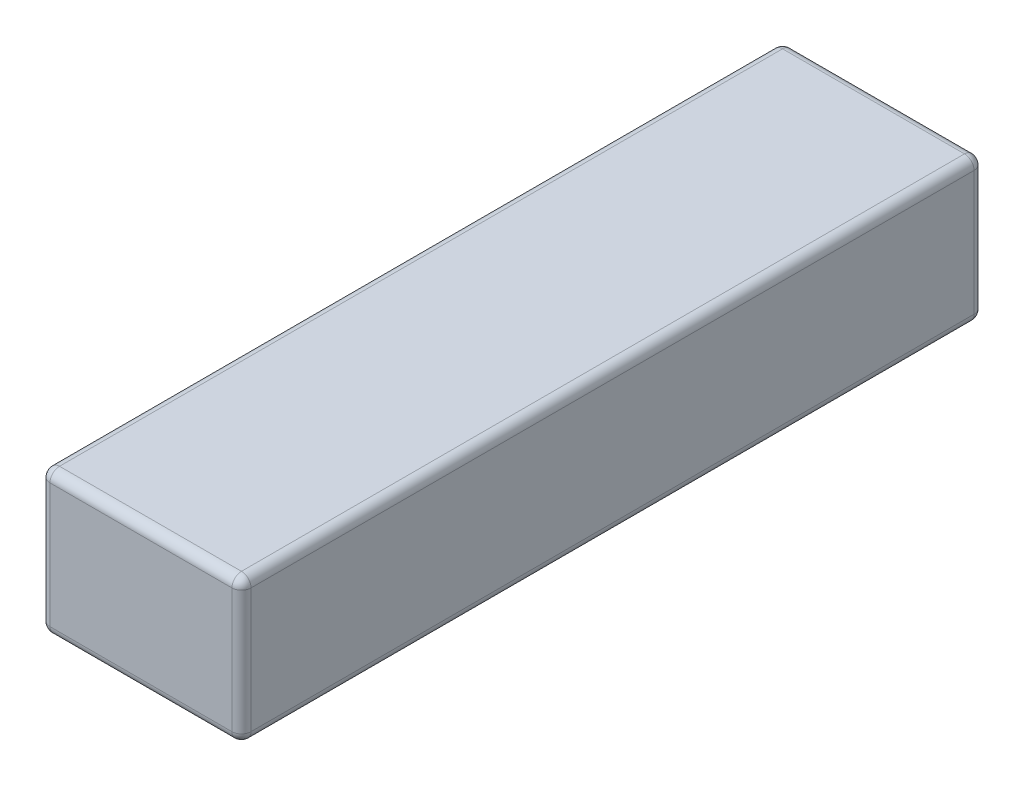
ISO-10303-21;
HEADER;
FILE_DESCRIPTION(('STEP AP214'),'2;1');
FILE_NAME('part.step','',(''),(''),'','','');
FILE_SCHEMA(('AUTOMOTIVE_DESIGN { 1 0 10303 214 1 1 1 1 }'));
ENDSEC;
DATA;
#1=APPLICATION_CONTEXT('core data for automotive mechanical design processes');
#2=APPLICATION_PROTOCOL_DEFINITION('international standard','automotive_design',2000,#1);
#3=PRODUCT_CONTEXT('',#1,'mechanical');
#4=PRODUCT('Part','Part','',(#3));
#5=PRODUCT_RELATED_PRODUCT_CATEGORY('part','',(#4));
#6=PRODUCT_DEFINITION_FORMATION('','',#4);
#7=PRODUCT_DEFINITION_CONTEXT('part definition',#1,'design');
#8=PRODUCT_DEFINITION('design','',#6,#7);
#9=PRODUCT_DEFINITION_SHAPE('','',#8);
#10=(LENGTH_UNIT() NAMED_UNIT(*) SI_UNIT(.MILLI.,.METRE.));
#11=(NAMED_UNIT(*) PLANE_ANGLE_UNIT() SI_UNIT($,.RADIAN.));
#12=(NAMED_UNIT(*) SI_UNIT($,.STERADIAN.) SOLID_ANGLE_UNIT());
#13=UNCERTAINTY_MEASURE_WITH_UNIT(LENGTH_MEASURE(1.E-05),#10,'distance_accuracy_value','');
#14=(GEOMETRIC_REPRESENTATION_CONTEXT(3) GLOBAL_UNCERTAINTY_ASSIGNED_CONTEXT((#13)) GLOBAL_UNIT_ASSIGNED_CONTEXT((#10,
#11,#12)) REPRESENTATION_CONTEXT('',''));
#15=CARTESIAN_POINT('',(0.,0.,0.));
#16=DIRECTION('',(0.,0.,1.));
#17=DIRECTION('',(1.,0.,0.));
#18=AXIS2_PLACEMENT_3D('',#15,#16,#17);
#19=CARTESIAN_POINT('',(10.1896832247371,17.1771844660194,155.));
#20=DIRECTION('',(-1.,0.,0.));
#21=DIRECTION('',(0.,-1.,0.));
#22=AXIS2_PLACEMENT_3D('',#19,#20,#21);
#23=PLANE('',#22);
#24=DIRECTION('',(0.,1.,0.));
#25=VECTOR('',#24,1.);
#26=CARTESIAN_POINT('',(10.1896832247371,-12.8228155339806,153.));
#27=LINE('',#26,#25);
#28=CARTESIAN_POINT('',(10.1896832247371,15.1771844660194,153.));
#29=VERTEX_POINT('',#28);
#30=CARTESIAN_POINT('',(10.1896832247371,-10.8228155339806,153.));
#31=VERTEX_POINT('',#30);
#32=EDGE_CURVE('E189',#29,#31,#27,.F.);
#33=ORIENTED_EDGE('',*,*,#32,.T.);
#34=DIRECTION('',(0.,0.,-1.));
#35=VECTOR('',#34,1.);
#36=CARTESIAN_POINT('',(10.1896832247371,-10.8228155339806,155.));
#37=LINE('',#36,#35);
#38=CARTESIAN_POINT('',(10.1896832247371,-10.8228155339806,2.));
#39=VERTEX_POINT('',#38);
#40=EDGE_CURVE('E192',#31,#39,#37,.T.);
#41=ORIENTED_EDGE('',*,*,#40,.T.);
#42=DIRECTION('',(0.,1.,0.));
#43=VECTOR('',#42,1.);
#44=CARTESIAN_POINT('',(10.1896832247371,17.1771844660194,2.));
#45=LINE('',#44,#43);
#46=CARTESIAN_POINT('',(10.1896832247371,15.1771844660194,2.));
#47=VERTEX_POINT('',#46);
#48=EDGE_CURVE('E187',#39,#47,#45,.T.);
#49=ORIENTED_EDGE('',*,*,#48,.T.);
#50=DIRECTION('',(0.,0.,-1.));
#51=VECTOR('',#50,1.);
#52=CARTESIAN_POINT('',(10.1896832247371,15.1771844660194,155.));
#53=LINE('',#52,#51);
#54=EDGE_CURVE('E185',#47,#29,#53,.F.);
#55=ORIENTED_EDGE('',*,*,#54,.T.);
#56=EDGE_LOOP('',(#33,#41,#49,#55));
#57=FACE_BOUND('',#56,.T.);
#58=ADVANCED_FACE('F33',(#57),#23,.F.);
#59=CARTESIAN_POINT('',(-31.810316775263,17.1771844660194,155.));
#60=DIRECTION('',(0.,-1.,0.));
#61=DIRECTION('',(0.,0.,-1.));
#62=AXIS2_PLACEMENT_3D('',#59,#60,#61);
#63=PLANE('',#62);
#64=DIRECTION('',(-1.,0.,0.));
#65=VECTOR('',#64,1.);
#66=CARTESIAN_POINT('',(-31.810316775263,17.1771844660194,2.));
#67=LINE('',#66,#65);
#68=CARTESIAN_POINT('',(8.18968322473706,17.1771844660194,2.));
#69=VERTEX_POINT('',#68);
#70=CARTESIAN_POINT('',(-29.8103167752629,17.1771844660194,2.));
#71=VERTEX_POINT('',#70);
#72=EDGE_CURVE('E178',#69,#71,#67,.T.);
#73=ORIENTED_EDGE('',*,*,#72,.T.);
#74=DIRECTION('',(0.,0.,-1.));
#75=VECTOR('',#74,1.);
#76=CARTESIAN_POINT('',(-29.8103167752629,17.1771844660194,155.));
#77=LINE('',#76,#75);
#78=CARTESIAN_POINT('',(-29.8103167752629,17.1771844660194,153.));
#79=VERTEX_POINT('',#78);
#80=EDGE_CURVE('E183',#71,#79,#77,.F.);
#81=ORIENTED_EDGE('',*,*,#80,.T.);
#82=DIRECTION('',(-1.,0.,0.));
#83=VECTOR('',#82,1.);
#84=CARTESIAN_POINT('',(10.1896832247371,17.1771844660194,153.));
#85=LINE('',#84,#83);
#86=CARTESIAN_POINT('',(8.18968322473706,17.1771844660194,153.));
#87=VERTEX_POINT('',#86);
#88=EDGE_CURVE('E180',#79,#87,#85,.F.);
#89=ORIENTED_EDGE('',*,*,#88,.T.);
#90=DIRECTION('',(0.,0.,-1.));
#91=VECTOR('',#90,1.);
#92=CARTESIAN_POINT('',(8.18968322473706,17.1771844660194,155.));
#93=LINE('',#92,#91);
#94=EDGE_CURVE('E176',#87,#69,#93,.T.);
#95=ORIENTED_EDGE('',*,*,#94,.T.);
#96=EDGE_LOOP('',(#73,#81,#89,#95));
#97=FACE_BOUND('',#96,.T.);
#98=ADVANCED_FACE('F279',(#97),#63,.F.);
#99=CARTESIAN_POINT('',(-31.810316775263,17.1771844660194,155.));
#100=DIRECTION('',(1.,0.,0.));
#101=DIRECTION('',(0.,0.,-1.));
#102=AXIS2_PLACEMENT_3D('',#99,#100,#101);
#103=PLANE('',#102);
#104=DIRECTION('',(0.,-1.,0.));
#105=VECTOR('',#104,1.);
#106=CARTESIAN_POINT('',(-31.810316775263,17.1771844660194,2.));
#107=LINE('',#106,#105);
#108=CARTESIAN_POINT('',(-31.810316775263,15.1771844660194,2.));
#109=VERTEX_POINT('',#108);
#110=CARTESIAN_POINT('',(-31.810316775263,-10.8228155339806,2.));
#111=VERTEX_POINT('',#110);
#112=EDGE_CURVE('E169',#109,#111,#107,.T.);
#113=ORIENTED_EDGE('',*,*,#112,.T.);
#114=DIRECTION('',(0.,0.,-1.));
#115=VECTOR('',#114,1.);
#116=CARTESIAN_POINT('',(-31.810316775263,-10.8228155339806,155.));
#117=LINE('',#116,#115);
#118=CARTESIAN_POINT('',(-31.810316775263,-10.8228155339806,153.));
#119=VERTEX_POINT('',#118);
#120=EDGE_CURVE('E174',#111,#119,#117,.F.);
#121=ORIENTED_EDGE('',*,*,#120,.T.);
#122=DIRECTION('',(0.,-1.,0.));
#123=VECTOR('',#122,1.);
#124=CARTESIAN_POINT('',(-31.810316775263,17.1771844660194,153.));
#125=LINE('',#124,#123);
#126=CARTESIAN_POINT('',(-31.810316775263,15.1771844660194,153.));
#127=VERTEX_POINT('',#126);
#128=EDGE_CURVE('E171',#119,#127,#125,.F.);
#129=ORIENTED_EDGE('',*,*,#128,.T.);
#130=DIRECTION('',(0.,0.,-1.));
#131=VECTOR('',#130,1.);
#132=CARTESIAN_POINT('',(-31.810316775263,15.1771844660194,155.));
#133=LINE('',#132,#131);
#134=EDGE_CURVE('E167',#127,#109,#133,.T.);
#135=ORIENTED_EDGE('',*,*,#134,.T.);
#136=EDGE_LOOP('',(#113,#121,#129,#135));
#137=FACE_BOUND('',#136,.T.);
#138=ADVANCED_FACE('F270',(#137),#103,.F.);
#139=CARTESIAN_POINT('',(-31.810316775263,-12.8228155339806,155.));
#140=DIRECTION('',(0.,1.,0.));
#141=DIRECTION('',(0.,0.,1.));
#142=AXIS2_PLACEMENT_3D('',#139,#140,#141);
#143=PLANE('',#142);
#144=DIRECTION('',(1.,0.,0.));
#145=VECTOR('',#144,1.);
#146=CARTESIAN_POINT('',(-31.810316775263,-12.8228155339806,153.));
#147=LINE('',#146,#145);
#148=CARTESIAN_POINT('',(8.18968322473706,-12.8228155339806,153.));
#149=VERTEX_POINT('',#148);
#150=CARTESIAN_POINT('',(-29.8103167752629,-12.8228155339806,153.));
#151=VERTEX_POINT('',#150);
#152=EDGE_CURVE('E128',#149,#151,#147,.F.);
#153=ORIENTED_EDGE('',*,*,#152,.T.);
#154=DIRECTION('',(0.,0.,-1.));
#155=VECTOR('',#154,1.);
#156=CARTESIAN_POINT('',(-29.8103167752629,-12.8228155339806,155.));
#157=LINE('',#156,#155);
#158=CARTESIAN_POINT('',(-29.8103167752629,-12.8228155339806,2.));
#159=VERTEX_POINT('',#158);
#160=EDGE_CURVE('E165',#151,#159,#157,.T.);
#161=ORIENTED_EDGE('',*,*,#160,.T.);
#162=DIRECTION('',(1.,0.,0.));
#163=VECTOR('',#162,1.);
#164=CARTESIAN_POINT('',(-31.810316775263,-12.8228155339806,2.));
#165=LINE('',#164,#163);
#166=CARTESIAN_POINT('',(8.18968322473706,-12.8228155339806,2.));
#167=VERTEX_POINT('',#166);
#168=EDGE_CURVE('E158',#159,#167,#165,.T.);
#169=ORIENTED_EDGE('',*,*,#168,.T.);
#170=DIRECTION('',(0.,0.,-1.));
#171=VECTOR('',#170,1.);
#172=CARTESIAN_POINT('',(8.18968322473706,-12.8228155339806,155.));
#173=LINE('',#172,#171);
#174=EDGE_CURVE('E156',#167,#149,#173,.F.);
#175=ORIENTED_EDGE('',*,*,#174,.T.);
#176=EDGE_LOOP('',(#153,#161,#169,#175));
#177=FACE_BOUND('',#176,.T.);
#178=ADVANCED_FACE('F307',(#177),#143,.F.);
#179=CARTESIAN_POINT('',(0.,0.,155.));
#180=DIRECTION('',(0.,0.,1.));
#181=DIRECTION('',(1.,0.,0.));
#182=AXIS2_PLACEMENT_3D('',#179,#180,#181);
#183=PLANE('',#182);
#184=DIRECTION('',(0.,-1.,0.));
#185=VECTOR('',#184,1.);
#186=CARTESIAN_POINT('',(-29.8103167752629,-12.8228155339806,155.));
#187=LINE('',#186,#185);
#188=CARTESIAN_POINT('',(-29.8103167752629,15.1771844660194,155.));
#189=VERTEX_POINT('',#188);
#190=CARTESIAN_POINT('',(-29.8103167752629,-10.8228155339806,155.));
#191=VERTEX_POINT('',#190);
#192=EDGE_CURVE('E154',#189,#191,#187,.T.);
#193=ORIENTED_EDGE('',*,*,#192,.T.);
#194=DIRECTION('',(1.,0.,0.));
#195=VECTOR('',#194,1.);
#196=CARTESIAN_POINT('',(10.1896832247371,-10.8228155339806,155.));
#197=LINE('',#196,#195);
#198=CARTESIAN_POINT('',(8.18968322473706,-10.8228155339806,155.));
#199=VERTEX_POINT('',#198);
#200=EDGE_CURVE('E126',#191,#199,#197,.T.);
#201=ORIENTED_EDGE('',*,*,#200,.T.);
#202=DIRECTION('',(0.,1.,0.));
#203=VECTOR('',#202,1.);
#204=CARTESIAN_POINT('',(8.18968322473706,17.1771844660194,155.));
#205=LINE('',#204,#203);
#206=CARTESIAN_POINT('',(8.18968322473706,15.1771844660194,155.));
#207=VERTEX_POINT('',#206);
#208=EDGE_CURVE('E144',#199,#207,#205,.T.);
#209=ORIENTED_EDGE('',*,*,#208,.T.);
#210=DIRECTION('',(-1.,0.,0.));
#211=VECTOR('',#210,1.);
#212=CARTESIAN_POINT('',(-31.810316775263,15.1771844660194,155.));
#213=LINE('',#212,#211);
#214=EDGE_CURVE('E150',#207,#189,#213,.T.);
#215=ORIENTED_EDGE('',*,*,#214,.T.);
#216=EDGE_LOOP('',(#193,#201,#209,#215));
#217=FACE_BOUND('',#216,.T.);
#218=ADVANCED_FACE('F152',(#217),#183,.T.);
#219=CARTESIAN_POINT('',(0.,0.,0.));
#220=DIRECTION('',(0.,0.,1.));
#221=DIRECTION('',(1.,0.,0.));
#222=AXIS2_PLACEMENT_3D('',#219,#220,#221);
#223=PLANE('',#222);
#224=DIRECTION('',(0.,-1.,0.));
#225=VECTOR('',#224,1.);
#226=CARTESIAN_POINT('',(-29.8103167752629,0.,0.));
#227=LINE('',#226,#225);
#228=CARTESIAN_POINT('',(-29.8103167752629,-10.8228155339806,0.));
#229=VERTEX_POINT('',#228);
#230=CARTESIAN_POINT('',(-29.8103167752629,15.1771844660194,0.));
#231=VERTEX_POINT('',#230);
#232=EDGE_CURVE('E42',#229,#231,#227,.F.);
#233=ORIENTED_EDGE('',*,*,#232,.T.);
#234=DIRECTION('',(-1.,0.,0.));
#235=VECTOR('',#234,1.);
#236=CARTESIAN_POINT('',(0.,15.1771844660194,0.));
#237=LINE('',#236,#235);
#238=CARTESIAN_POINT('',(8.18968322473706,15.1771844660194,0.));
#239=VERTEX_POINT('',#238);
#240=EDGE_CURVE('E11',#231,#239,#237,.F.);
#241=ORIENTED_EDGE('',*,*,#240,.T.);
#242=DIRECTION('',(0.,1.,0.));
#243=VECTOR('',#242,1.);
#244=CARTESIAN_POINT('',(8.18968322473706,0.,0.));
#245=LINE('',#244,#243);
#246=CARTESIAN_POINT('',(8.18968322473706,-10.8228155339806,0.));
#247=VERTEX_POINT('',#246);
#248=EDGE_CURVE('E194',#239,#247,#245,.F.);
#249=ORIENTED_EDGE('',*,*,#248,.T.);
#250=DIRECTION('',(1.,0.,0.));
#251=VECTOR('',#250,1.);
#252=CARTESIAN_POINT('',(0.,-10.8228155339806,0.));
#253=LINE('',#252,#251);
#254=EDGE_CURVE('E53',#247,#229,#253,.F.);
#255=ORIENTED_EDGE('',*,*,#254,.T.);
#256=EDGE_LOOP('',(#233,#241,#249,#255));
#257=FACE_BOUND('',#256,.T.);
#258=ADVANCED_FACE('F291',(#257),#223,.F.);
#259=CARTESIAN_POINT('',(-31.810316775263,15.1771844660194,2.));
#260=DIRECTION('',(-1.,0.,0.));
#261=DIRECTION('',(0.,0.,1.));
#262=AXIS2_PLACEMENT_3D('',#259,#260,#261);
#263=CYLINDRICAL_SURFACE('',#262,2.);
#264=CARTESIAN_POINT('',(-29.8103167752629,15.1771844660194,2.));
#265=DIRECTION('',(-1.,0.,0.));
#266=DIRECTION('',(0.,0.,1.));
#267=AXIS2_PLACEMENT_3D('',#264,#265,#266);
#268=CIRCLE('',#267,2.);
#269=EDGE_CURVE('E37',#71,#231,#268,.T.);
#270=ORIENTED_EDGE('',*,*,#269,.F.);
#271=ORIENTED_EDGE('',*,*,#72,.F.);
#272=CARTESIAN_POINT('',(8.18968322473706,15.1771844660194,2.));
#273=DIRECTION('',(1.,0.,0.));
#274=DIRECTION('',(0.,1.,0.));
#275=AXIS2_PLACEMENT_3D('',#272,#273,#274);
#276=CIRCLE('',#275,2.);
#277=EDGE_CURVE('E248',#239,#69,#276,.T.);
#278=ORIENTED_EDGE('',*,*,#277,.F.);
#279=ORIENTED_EDGE('',*,*,#240,.F.);
#280=EDGE_LOOP('',(#270,#271,#278,#279));
#281=FACE_BOUND('',#280,.T.);
#282=ADVANCED_FACE('F35',(#281),#263,.T.);
#283=CARTESIAN_POINT('',(-29.8103167752629,15.1771844660194,2.));
#284=DIRECTION('',(0.,0.,1.));
#285=DIRECTION('',(1.,0.,0.));
#286=AXIS2_PLACEMENT_3D('',#283,#284,#285);
#287=SPHERICAL_SURFACE('',#286,2.);
#288=CARTESIAN_POINT('',(-29.8103167752629,15.1771844660194,2.));
#289=DIRECTION('',(0.,0.,-1.));
#290=DIRECTION('',(-1.,0.,0.));
#291=AXIS2_PLACEMENT_3D('',#288,#289,#290);
#292=CIRCLE('',#291,2.);
#293=EDGE_CURVE('E243',#71,#109,#292,.F.);
#294=ORIENTED_EDGE('',*,*,#293,.F.);
#295=ORIENTED_EDGE('',*,*,#269,.T.);
#296=CARTESIAN_POINT('',(-29.8103167752629,15.1771844660194,2.));
#297=DIRECTION('',(0.,1.,0.));
#298=DIRECTION('',(0.,0.,1.));
#299=AXIS2_PLACEMENT_3D('',#296,#297,#298);
#300=CIRCLE('',#299,2.);
#301=EDGE_CURVE('E246',#109,#231,#300,.F.);
#302=ORIENTED_EDGE('',*,*,#301,.F.);
#303=EDGE_LOOP('',(#294,#295,#302));
#304=FACE_BOUND('',#303,.T.);
#305=ADVANCED_FACE('F259',(#304),#287,.T.);
#306=CARTESIAN_POINT('',(8.18968322473706,15.1771844660194,2.));
#307=DIRECTION('',(0.,0.,1.));
#308=DIRECTION('',(1.,0.,0.));
#309=AXIS2_PLACEMENT_3D('',#306,#307,#308);
#310=SPHERICAL_SURFACE('',#309,2.);
#311=CARTESIAN_POINT('',(8.18968322473706,15.1771844660194,2.));
#312=DIRECTION('',(0.,1.,0.));
#313=DIRECTION('',(0.,0.,1.));
#314=AXIS2_PLACEMENT_3D('',#311,#312,#313);
#315=CIRCLE('',#314,2.);
#316=EDGE_CURVE('E237',#239,#47,#315,.F.);
#317=ORIENTED_EDGE('',*,*,#316,.F.);
#318=ORIENTED_EDGE('',*,*,#277,.T.);
#319=CARTESIAN_POINT('',(8.18968322473706,15.1771844660194,2.));
#320=DIRECTION('',(0.,0.,-1.));
#321=DIRECTION('',(-1.,0.,0.));
#322=AXIS2_PLACEMENT_3D('',#319,#320,#321);
#323=CIRCLE('',#322,2.);
#324=EDGE_CURVE('E240',#47,#69,#323,.F.);
#325=ORIENTED_EDGE('',*,*,#324,.F.);
#326=EDGE_LOOP('',(#317,#318,#325));
#327=FACE_BOUND('',#326,.T.);
#328=ADVANCED_FACE('F458',(#327),#310,.T.);
#329=CARTESIAN_POINT('',(-29.8103167752629,17.1771844660194,2.));
#330=DIRECTION('',(0.,-1.,0.));
#331=DIRECTION('',(0.,0.,-1.));
#332=AXIS2_PLACEMENT_3D('',#329,#330,#331);
#333=CYLINDRICAL_SURFACE('',#332,2.);
#334=ORIENTED_EDGE('',*,*,#301,.T.);
#335=ORIENTED_EDGE('',*,*,#232,.F.);
#336=CARTESIAN_POINT('',(-29.8103167752629,-10.8228155339806,2.));
#337=DIRECTION('',(0.,-1.,0.));
#338=DIRECTION('',(0.,0.,-1.));
#339=AXIS2_PLACEMENT_3D('',#336,#337,#338);
#340=CIRCLE('',#339,2.);
#341=EDGE_CURVE('E231',#111,#229,#340,.T.);
#342=ORIENTED_EDGE('',*,*,#341,.F.);
#343=ORIENTED_EDGE('',*,*,#112,.F.);
#344=EDGE_LOOP('',(#334,#335,#342,#343));
#345=FACE_BOUND('',#344,.T.);
#346=ADVANCED_FACE('F265',(#345),#333,.T.);
#347=CARTESIAN_POINT('',(-29.8103167752629,15.1771844660194,155.));
#348=DIRECTION('',(0.,0.,-1.));
#349=DIRECTION('',(-1.,0.,0.));
#350=AXIS2_PLACEMENT_3D('',#347,#348,#349);
#351=CYLINDRICAL_SURFACE('',#350,2.);
#352=ORIENTED_EDGE('',*,*,#293,.T.);
#353=ORIENTED_EDGE('',*,*,#134,.F.);
#354=CARTESIAN_POINT('',(-29.8103167752629,15.1771844660194,153.));
#355=DIRECTION('',(0.,0.,1.));
#356=DIRECTION('',(1.,0.,0.));
#357=AXIS2_PLACEMENT_3D('',#354,#355,#356);
#358=CIRCLE('',#357,2.);
#359=EDGE_CURVE('E228',#79,#127,#358,.T.);
#360=ORIENTED_EDGE('',*,*,#359,.F.);
#361=ORIENTED_EDGE('',*,*,#80,.F.);
#362=EDGE_LOOP('',(#352,#353,#360,#361));
#363=FACE_BOUND('',#362,.T.);
#364=ADVANCED_FACE('F276',(#363),#351,.T.);
#365=CARTESIAN_POINT('',(0.,15.1771844660194,153.));
#366=DIRECTION('',(1.,0.,0.));
#367=DIRECTION('',(0.,0.,-1.));
#368=AXIS2_PLACEMENT_3D('',#365,#366,#367);
#369=CYLINDRICAL_SURFACE('',#368,2.);
#370=CARTESIAN_POINT('',(8.18968322473706,15.1771844660194,153.));
#371=DIRECTION('',(1.,0.,0.));
#372=DIRECTION('',(0.,0.,-1.));
#373=AXIS2_PLACEMENT_3D('',#370,#371,#372);
#374=CIRCLE('',#373,2.);
#375=EDGE_CURVE('E222',#87,#207,#374,.T.);
#376=ORIENTED_EDGE('',*,*,#375,.F.);
#377=ORIENTED_EDGE('',*,*,#88,.F.);
#378=CARTESIAN_POINT('',(-29.8103167752629,15.1771844660194,153.));
#379=DIRECTION('',(-1.,0.,0.));
#380=DIRECTION('',(0.,0.,1.));
#381=AXIS2_PLACEMENT_3D('',#378,#379,#380);
#382=CIRCLE('',#381,2.);
#383=EDGE_CURVE('E225',#189,#79,#382,.T.);
#384=ORIENTED_EDGE('',*,*,#383,.F.);
#385=ORIENTED_EDGE('',*,*,#214,.F.);
#386=EDGE_LOOP('',(#376,#377,#384,#385));
#387=FACE_BOUND('',#386,.T.);
#388=ADVANCED_FACE('F283',(#387),#369,.T.);
#389=CARTESIAN_POINT('',(8.18968322473706,15.1771844660194,155.));
#390=DIRECTION('',(0.,0.,-1.));
#391=DIRECTION('',(-1.,0.,0.));
#392=AXIS2_PLACEMENT_3D('',#389,#390,#391);
#393=CYLINDRICAL_SURFACE('',#392,2.);
#394=ORIENTED_EDGE('',*,*,#324,.T.);
#395=ORIENTED_EDGE('',*,*,#94,.F.);
#396=CARTESIAN_POINT('',(8.18968322473706,15.1771844660194,153.));
#397=DIRECTION('',(0.,0.,1.));
#398=DIRECTION('',(1.,0.,0.));
#399=AXIS2_PLACEMENT_3D('',#396,#397,#398);
#400=CIRCLE('',#399,2.);
#401=EDGE_CURVE('E220',#29,#87,#400,.T.);
#402=ORIENTED_EDGE('',*,*,#401,.F.);
#403=ORIENTED_EDGE('',*,*,#54,.F.);
#404=EDGE_LOOP('',(#394,#395,#402,#403));
#405=FACE_BOUND('',#404,.T.);
#406=ADVANCED_FACE('F289',(#405),#393,.T.);
#407=CARTESIAN_POINT('',(8.18968322473706,17.1771844660194,2.));
#408=DIRECTION('',(0.,1.,0.));
#409=DIRECTION('',(-1.,0.,0.));
#410=AXIS2_PLACEMENT_3D('',#407,#408,#409);
#411=CYLINDRICAL_SURFACE('',#410,2.);
#412=ORIENTED_EDGE('',*,*,#316,.T.);
#413=ORIENTED_EDGE('',*,*,#48,.F.);
#414=CARTESIAN_POINT('',(8.18968322473706,-10.8228155339806,2.));
#415=DIRECTION('',(0.,-1.,0.));
#416=DIRECTION('',(1.,0.,0.));
#417=AXIS2_PLACEMENT_3D('',#414,#415,#416);
#418=CIRCLE('',#417,2.);
#419=EDGE_CURVE('E217',#247,#39,#418,.T.);
#420=ORIENTED_EDGE('',*,*,#419,.F.);
#421=ORIENTED_EDGE('',*,*,#248,.F.);
#422=EDGE_LOOP('',(#412,#413,#420,#421));
#423=FACE_BOUND('',#422,.T.);
#424=ADVANCED_FACE('F300',(#423),#411,.T.);
#425=CARTESIAN_POINT('',(-31.810316775263,-10.8228155339806,2.));
#426=DIRECTION('',(1.,0.,0.));
#427=DIRECTION('',(0.,0.,-1.));
#428=AXIS2_PLACEMENT_3D('',#425,#426,#427);
#429=CYLINDRICAL_SURFACE('',#428,2.);
#430=CARTESIAN_POINT('',(-29.8103167752629,-10.8228155339806,2.));
#431=DIRECTION('',(-1.,0.,0.));
#432=DIRECTION('',(0.,0.,1.));
#433=AXIS2_PLACEMENT_3D('',#430,#431,#432);
#434=CIRCLE('',#433,2.);
#435=EDGE_CURVE('E234',#229,#159,#434,.T.);
#436=ORIENTED_EDGE('',*,*,#435,.F.);
#437=ORIENTED_EDGE('',*,*,#254,.F.);
#438=CARTESIAN_POINT('',(8.18968322473706,-10.8228155339806,2.));
#439=DIRECTION('',(1.,0.,0.));
#440=DIRECTION('',(0.,0.,-1.));
#441=AXIS2_PLACEMENT_3D('',#438,#439,#440);
#442=CIRCLE('',#441,2.);
#443=EDGE_CURVE('E214',#167,#247,#442,.T.);
#444=ORIENTED_EDGE('',*,*,#443,.F.);
#445=ORIENTED_EDGE('',*,*,#168,.F.);
#446=EDGE_LOOP('',(#436,#437,#444,#445));
#447=FACE_BOUND('',#446,.T.);
#448=ADVANCED_FACE('F296',(#447),#429,.T.);
#449=CARTESIAN_POINT('',(-29.8103167752629,-10.8228155339806,2.));
#450=DIRECTION('',(0.,0.,1.));
#451=DIRECTION('',(1.,0.,0.));
#452=AXIS2_PLACEMENT_3D('',#449,#450,#451);
#453=SPHERICAL_SURFACE('',#452,2.);
#454=ORIENTED_EDGE('',*,*,#341,.T.);
#455=ORIENTED_EDGE('',*,*,#435,.T.);
#456=CARTESIAN_POINT('',(-29.8103167752629,-10.8228155339806,2.));
#457=DIRECTION('',(0.,0.,-1.));
#458=DIRECTION('',(-1.,0.,0.));
#459=AXIS2_PLACEMENT_3D('',#456,#457,#458);
#460=CIRCLE('',#459,2.);
#461=EDGE_CURVE('E211',#111,#159,#460,.F.);
#462=ORIENTED_EDGE('',*,*,#461,.F.);
#463=EDGE_LOOP('',(#454,#455,#462));
#464=FACE_BOUND('',#463,.T.);
#465=ADVANCED_FACE('F310',(#464),#453,.T.);
#466=CARTESIAN_POINT('',(-29.8103167752629,15.1771844660194,153.));
#467=DIRECTION('',(0.,0.,1.));
#468=DIRECTION('',(1.,0.,0.));
#469=AXIS2_PLACEMENT_3D('',#466,#467,#468);
#470=SPHERICAL_SURFACE('',#469,2.);
#471=ORIENTED_EDGE('',*,*,#383,.T.);
#472=ORIENTED_EDGE('',*,*,#359,.T.);
#473=CARTESIAN_POINT('',(-29.8103167752629,15.1771844660194,153.));
#474=DIRECTION('',(0.,1.,0.));
#475=DIRECTION('',(0.,0.,1.));
#476=AXIS2_PLACEMENT_3D('',#473,#474,#475);
#477=CIRCLE('',#476,2.);
#478=EDGE_CURVE('E209',#189,#127,#477,.F.);
#479=ORIENTED_EDGE('',*,*,#478,.F.);
#480=EDGE_LOOP('',(#471,#472,#479));
#481=FACE_BOUND('',#480,.T.);
#482=ADVANCED_FACE('F320',(#481),#470,.T.);
#483=CARTESIAN_POINT('',(8.18968322473706,15.1771844660194,153.));
#484=DIRECTION('',(0.,0.,1.));
#485=DIRECTION('',(1.,0.,0.));
#486=AXIS2_PLACEMENT_3D('',#483,#484,#485);
#487=SPHERICAL_SURFACE('',#486,2.);
#488=ORIENTED_EDGE('',*,*,#401,.T.);
#489=ORIENTED_EDGE('',*,*,#375,.T.);
#490=CARTESIAN_POINT('',(8.18968322473706,15.1771844660194,153.));
#491=DIRECTION('',(0.,1.,0.));
#492=DIRECTION('',(0.,0.,1.));
#493=AXIS2_PLACEMENT_3D('',#490,#491,#492);
#494=CIRCLE('',#493,2.);
#495=EDGE_CURVE('E147',#29,#207,#494,.F.);
#496=ORIENTED_EDGE('',*,*,#495,.F.);
#497=EDGE_LOOP('',(#488,#489,#496));
#498=FACE_BOUND('',#497,.T.);
#499=ADVANCED_FACE('F322',(#498),#487,.T.);
#500=CARTESIAN_POINT('',(8.18968322473706,-10.8228155339806,2.));
#501=DIRECTION('',(0.,0.,1.));
#502=DIRECTION('',(1.,0.,0.));
#503=AXIS2_PLACEMENT_3D('',#500,#501,#502);
#504=SPHERICAL_SURFACE('',#503,2.);
#505=ORIENTED_EDGE('',*,*,#443,.T.);
#506=ORIENTED_EDGE('',*,*,#419,.T.);
#507=CARTESIAN_POINT('',(8.18968322473706,-10.8228155339806,2.));
#508=DIRECTION('',(0.,0.,-1.));
#509=DIRECTION('',(-1.,0.,0.));
#510=AXIS2_PLACEMENT_3D('',#507,#508,#509);
#511=CIRCLE('',#510,2.);
#512=EDGE_CURVE('E205',#167,#39,#511,.F.);
#513=ORIENTED_EDGE('',*,*,#512,.F.);
#514=EDGE_LOOP('',(#505,#506,#513));
#515=FACE_BOUND('',#514,.T.);
#516=ADVANCED_FACE('F302',(#515),#504,.T.);
#517=CARTESIAN_POINT('',(-29.8103167752629,-10.8228155339806,155.));
#518=DIRECTION('',(0.,0.,-1.));
#519=DIRECTION('',(-1.,0.,0.));
#520=AXIS2_PLACEMENT_3D('',#517,#518,#519);
#521=CYLINDRICAL_SURFACE('',#520,2.);
#522=ORIENTED_EDGE('',*,*,#461,.T.);
#523=ORIENTED_EDGE('',*,*,#160,.F.);
#524=CARTESIAN_POINT('',(-29.8103167752629,-10.8228155339806,153.));
#525=DIRECTION('',(0.,0.,1.));
#526=DIRECTION('',(1.,0.,0.));
#527=AXIS2_PLACEMENT_3D('',#524,#525,#526);
#528=CIRCLE('',#527,2.);
#529=EDGE_CURVE('E202',#119,#151,#528,.T.);
#530=ORIENTED_EDGE('',*,*,#529,.F.);
#531=ORIENTED_EDGE('',*,*,#120,.F.);
#532=EDGE_LOOP('',(#522,#523,#530,#531));
#533=FACE_BOUND('',#532,.T.);
#534=ADVANCED_FACE('F312',(#533),#521,.T.);
#535=CARTESIAN_POINT('',(-29.8103167752629,0.,153.));
#536=DIRECTION('',(0.,1.,0.));
#537=DIRECTION('',(0.,0.,1.));
#538=AXIS2_PLACEMENT_3D('',#535,#536,#537);
#539=CYLINDRICAL_SURFACE('',#538,2.);
#540=ORIENTED_EDGE('',*,*,#478,.T.);
#541=ORIENTED_EDGE('',*,*,#128,.F.);
#542=CARTESIAN_POINT('',(-29.8103167752629,-10.8228155339806,153.));
#543=DIRECTION('',(0.,-1.,0.));
#544=DIRECTION('',(0.,0.,-1.));
#545=AXIS2_PLACEMENT_3D('',#542,#543,#544);
#546=CIRCLE('',#545,2.);
#547=EDGE_CURVE('E141',#191,#119,#546,.T.);
#548=ORIENTED_EDGE('',*,*,#547,.F.);
#549=ORIENTED_EDGE('',*,*,#192,.F.);
#550=EDGE_LOOP('',(#540,#541,#548,#549));
#551=FACE_BOUND('',#550,.T.);
#552=ADVANCED_FACE('F318',(#551),#539,.T.);
#553=CARTESIAN_POINT('',(8.18968322473706,0.,153.));
#554=DIRECTION('',(0.,-1.,0.));
#555=DIRECTION('',(1.,0.,0.));
#556=AXIS2_PLACEMENT_3D('',#553,#554,#555);
#557=CYLINDRICAL_SURFACE('',#556,2.);
#558=ORIENTED_EDGE('',*,*,#495,.T.);
#559=ORIENTED_EDGE('',*,*,#208,.F.);
#560=CARTESIAN_POINT('',(8.18968322473706,-10.8228155339806,153.));
#561=DIRECTION('',(0.,-1.,0.));
#562=DIRECTION('',(0.,0.,-1.));
#563=AXIS2_PLACEMENT_3D('',#560,#561,#562);
#564=CIRCLE('',#563,2.);
#565=EDGE_CURVE('E133',#31,#199,#564,.T.);
#566=ORIENTED_EDGE('',*,*,#565,.F.);
#567=ORIENTED_EDGE('',*,*,#32,.F.);
#568=EDGE_LOOP('',(#558,#559,#566,#567));
#569=FACE_BOUND('',#568,.T.);
#570=ADVANCED_FACE('F145',(#569),#557,.T.);
#571=CARTESIAN_POINT('',(8.18968322473706,-10.8228155339806,155.));
#572=DIRECTION('',(0.,0.,-1.));
#573=DIRECTION('',(-1.,0.,0.));
#574=AXIS2_PLACEMENT_3D('',#571,#572,#573);
#575=CYLINDRICAL_SURFACE('',#574,2.);
#576=ORIENTED_EDGE('',*,*,#512,.T.);
#577=ORIENTED_EDGE('',*,*,#40,.F.);
#578=CARTESIAN_POINT('',(8.18968322473706,-10.8228155339806,153.));
#579=DIRECTION('',(0.,0.,1.));
#580=DIRECTION('',(1.,0.,0.));
#581=AXIS2_PLACEMENT_3D('',#578,#579,#580);
#582=CIRCLE('',#581,2.);
#583=EDGE_CURVE('E137',#149,#31,#582,.T.);
#584=ORIENTED_EDGE('',*,*,#583,.F.);
#585=ORIENTED_EDGE('',*,*,#174,.F.);
#586=EDGE_LOOP('',(#576,#577,#584,#585));
#587=FACE_BOUND('',#586,.T.);
#588=ADVANCED_FACE('F305',(#587),#575,.T.);
#589=CARTESIAN_POINT('',(-29.8103167752629,-10.8228155339806,153.));
#590=DIRECTION('',(0.,0.,1.));
#591=DIRECTION('',(1.,0.,0.));
#592=AXIS2_PLACEMENT_3D('',#589,#590,#591);
#593=SPHERICAL_SURFACE('',#592,2.);
#594=ORIENTED_EDGE('',*,*,#547,.T.);
#595=ORIENTED_EDGE('',*,*,#529,.T.);
#596=CARTESIAN_POINT('',(-29.8103167752629,-10.8228155339806,153.));
#597=DIRECTION('',(-1.,0.,0.));
#598=DIRECTION('',(0.,0.,1.));
#599=AXIS2_PLACEMENT_3D('',#596,#597,#598);
#600=CIRCLE('',#599,2.);
#601=EDGE_CURVE('E130',#191,#151,#600,.F.);
#602=ORIENTED_EDGE('',*,*,#601,.F.);
#603=EDGE_LOOP('',(#594,#595,#602));
#604=FACE_BOUND('',#603,.T.);
#605=ADVANCED_FACE('F316',(#604),#593,.T.);
#606=CARTESIAN_POINT('',(8.18968322473706,-10.8228155339806,153.));
#607=DIRECTION('',(0.,0.,1.));
#608=DIRECTION('',(1.,0.,0.));
#609=AXIS2_PLACEMENT_3D('',#606,#607,#608);
#610=SPHERICAL_SURFACE('',#609,2.);
#611=ORIENTED_EDGE('',*,*,#583,.T.);
#612=ORIENTED_EDGE('',*,*,#565,.T.);
#613=CARTESIAN_POINT('',(8.18968322473706,-10.8228155339806,153.));
#614=DIRECTION('',(1.,0.,0.));
#615=DIRECTION('',(0.,0.,-1.));
#616=AXIS2_PLACEMENT_3D('',#613,#614,#615);
#617=CIRCLE('',#616,2.);
#618=EDGE_CURVE('E122',#149,#199,#617,.F.);
#619=ORIENTED_EDGE('',*,*,#618,.F.);
#620=EDGE_LOOP('',(#611,#612,#619));
#621=FACE_BOUND('',#620,.T.);
#622=ADVANCED_FACE('F135',(#621),#610,.T.);
#623=CARTESIAN_POINT('',(0.,-10.8228155339806,153.));
#624=DIRECTION('',(-1.,0.,0.));
#625=DIRECTION('',(0.,0.,1.));
#626=AXIS2_PLACEMENT_3D('',#623,#624,#625);
#627=CYLINDRICAL_SURFACE('',#626,2.);
#628=ORIENTED_EDGE('',*,*,#601,.T.);
#629=ORIENTED_EDGE('',*,*,#152,.F.);
#630=ORIENTED_EDGE('',*,*,#618,.T.);
#631=ORIENTED_EDGE('',*,*,#200,.F.);
#632=EDGE_LOOP('',(#628,#629,#630,#631));
#633=FACE_BOUND('',#632,.T.);
#634=ADVANCED_FACE('F124',(#633),#627,.T.);
#635=CLOSED_SHELL('',(#58,#98,#138,#178,#218,#258,#282,#305,#328,#346,#364,#388,#406,#424,#448,
#465,#482,#499,#516,#534,#552,#570,#588,#605,#622,#634));
#636=MANIFOLD_SOLID_BREP('B2',#635);
#637=ADVANCED_BREP_SHAPE_REPRESENTATION('',(#18,#636),#14);
#638=SHAPE_DEFINITION_REPRESENTATION(#9,#637);
ENDSEC;
END-ISO-10303-21;
